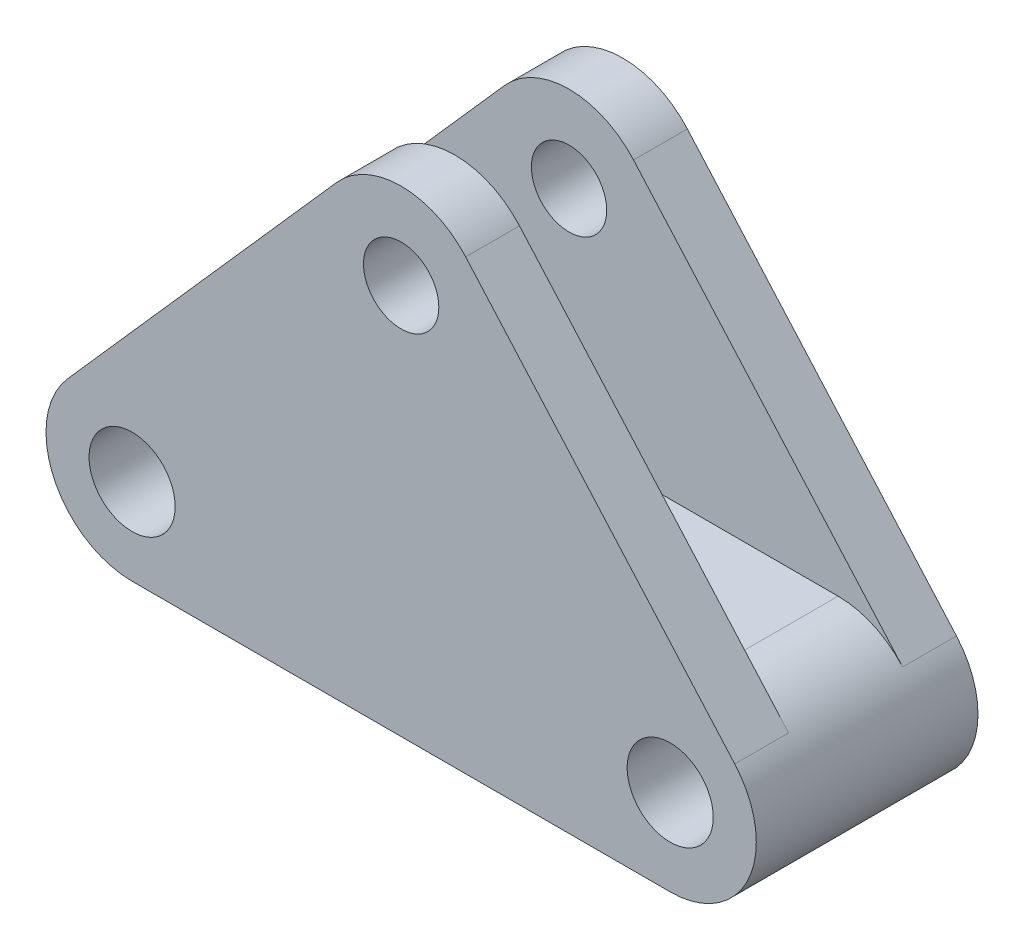
ISO-10303-21;
HEADER;
FILE_DESCRIPTION(('STEP AP214'),'2;1');
FILE_NAME('part.step','',(''),(''),'','','');
FILE_SCHEMA(('AUTOMOTIVE_DESIGN { 1 0 10303 214 1 1 1 1 }'));
ENDSEC;
DATA;
#1=APPLICATION_CONTEXT('core data for automotive mechanical design processes');
#2=APPLICATION_PROTOCOL_DEFINITION('international standard','automotive_design',2000,#1);
#3=PRODUCT_CONTEXT('',#1,'mechanical');
#4=PRODUCT('Part','Part','',(#3));
#5=PRODUCT_RELATED_PRODUCT_CATEGORY('part','',(#4));
#6=PRODUCT_DEFINITION_FORMATION('','',#4);
#7=PRODUCT_DEFINITION_CONTEXT('part definition',#1,'design');
#8=PRODUCT_DEFINITION('design','',#6,#7);
#9=PRODUCT_DEFINITION_SHAPE('','',#8);
#10=(LENGTH_UNIT() NAMED_UNIT(*) SI_UNIT(.MILLI.,.METRE.));
#11=(NAMED_UNIT(*) PLANE_ANGLE_UNIT() SI_UNIT($,.RADIAN.));
#12=(NAMED_UNIT(*) SI_UNIT($,.STERADIAN.) SOLID_ANGLE_UNIT());
#13=UNCERTAINTY_MEASURE_WITH_UNIT(LENGTH_MEASURE(1.E-05),#10,'distance_accuracy_value','');
#14=(GEOMETRIC_REPRESENTATION_CONTEXT(3) GLOBAL_UNCERTAINTY_ASSIGNED_CONTEXT((#13)) GLOBAL_UNIT_ASSIGNED_CONTEXT((#10,
#11,#12)) REPRESENTATION_CONTEXT('',''));
#15=CARTESIAN_POINT('',(0.,0.,0.));
#16=DIRECTION('',(0.,0.,1.));
#17=DIRECTION('',(1.,0.,0.));
#18=AXIS2_PLACEMENT_3D('',#15,#16,#17);
#19=CARTESIAN_POINT('',(0.,0.,-5.));
#20=DIRECTION('',(0.,0.,1.));
#21=DIRECTION('',(1.,0.,0.));
#22=AXIS2_PLACEMENT_3D('',#19,#20,#21);
#23=PLANE('',#22);
#24=CARTESIAN_POINT('',(0.,0.,-5.));
#25=DIRECTION('',(0.,0.,1.));
#26=DIRECTION('',(1.,0.,0.));
#27=AXIS2_PLACEMENT_3D('',#24,#25,#26);
#28=CIRCLE('',#27,3.5);
#29=CARTESIAN_POINT('',(3.5,0.,-5.));
#30=VERTEX_POINT('',#29);
#31=EDGE_CURVE('E219',#30,#30,#28,.T.);
#32=ORIENTED_EDGE('',*,*,#31,.T.);
#33=EDGE_LOOP('',(#32));
#34=FACE_BOUND('',#33,.T.);
#35=CARTESIAN_POINT('',(25.,-28.3,-5.));
#36=DIRECTION('',(0.,0.,1.));
#37=DIRECTION('',(1.,0.,0.));
#38=AXIS2_PLACEMENT_3D('',#35,#36,#37);
#39=CIRCLE('',#38,8.);
#40=CARTESIAN_POINT('',(25.,-20.3,-5.));
#41=VERTEX_POINT('',#40);
#42=CARTESIAN_POINT('',(30.9956104915912,-23.0035243007145,-5.));
#43=VERTEX_POINT('',#42);
#44=EDGE_CURVE('E196',#41,#43,#39,.F.);
#45=ORIENTED_EDGE('',*,*,#44,.F.);
#46=DIRECTION('',(1.,0.,0.));
#47=VECTOR('',#46,1.);
#48=CARTESIAN_POINT('',(0.,-20.3,-5.));
#49=LINE('',#48,#47);
#50=CARTESIAN_POINT('',(-25.,-20.3,-5.));
#51=VERTEX_POINT('',#50);
#52=EDGE_CURVE('E194',#51,#41,#49,.T.);
#53=ORIENTED_EDGE('',*,*,#52,.F.);
#54=CARTESIAN_POINT('',(-25.,-28.3,-5.));
#55=DIRECTION('',(0.,0.,1.));
#56=DIRECTION('',(1.,0.,0.));
#57=AXIS2_PLACEMENT_3D('',#54,#55,#56);
#58=CIRCLE('',#57,8.);
#59=CARTESIAN_POINT('',(-30.9956104915912,-23.0035243007145,-5.));
#60=VERTEX_POINT('',#59);
#61=EDGE_CURVE('E186',#51,#60,#58,.T.);
#62=ORIENTED_EDGE('',*,*,#61,.T.);
#63=DIRECTION('',(0.662059462410687,0.749451311448898,0.));
#64=VECTOR('',#63,1.);
#65=CARTESIAN_POINT('',(-5.99561049159118,5.2964756992855,-5.));
#66=LINE('',#65,#64);
#67=CARTESIAN_POINT('',(-5.99561049159118,5.2964756992855,-5.));
#68=VERTEX_POINT('',#67);
#69=EDGE_CURVE('E217',#60,#68,#66,.T.);
#70=ORIENTED_EDGE('',*,*,#69,.T.);
#71=CARTESIAN_POINT('',(0.,0.,-5.));
#72=DIRECTION('',(0.,0.,1.));
#73=DIRECTION('',(1.,0.,0.));
#74=AXIS2_PLACEMENT_3D('',#71,#72,#73);
#75=CIRCLE('',#74,8.00000000000001);
#76=CARTESIAN_POINT('',(5.99561049159119,5.2964756992855,-5.));
#77=VERTEX_POINT('',#76);
#78=EDGE_CURVE('E220',#68,#77,#75,.F.);
#79=ORIENTED_EDGE('',*,*,#78,.T.);
#80=DIRECTION('',(-0.662059462410687,0.749451311448897,0.));
#81=VECTOR('',#80,1.);
#82=CARTESIAN_POINT('',(5.99561049159119,5.2964756992855,-5.));
#83=LINE('',#82,#81);
#84=EDGE_CURVE('E226',#43,#77,#83,.T.);
#85=ORIENTED_EDGE('',*,*,#84,.F.);
#86=EDGE_LOOP('',(#45,#53,#62,#70,#79,#85));
#87=FACE_BOUND('',#86,.T.);
#88=ADVANCED_FACE('F35',(#34,#87),#23,.F.);
#89=CARTESIAN_POINT('',(25.,-28.3,-5.));
#90=DIRECTION('',(0.,0.,1.));
#91=DIRECTION('',(1.,0.,0.));
#92=AXIS2_PLACEMENT_3D('',#89,#90,#91);
#93=CYLINDRICAL_SURFACE('',#92,8.);
#94=CARTESIAN_POINT('',(25.,-28.3,0.));
#95=DIRECTION('',(0.,0.,1.));
#96=DIRECTION('',(1.,0.,0.));
#97=AXIS2_PLACEMENT_3D('',#94,#95,#96);
#98=CIRCLE('',#97,8.);
#99=CARTESIAN_POINT('',(30.9956104915912,-23.0035243007145,0.));
#100=VERTEX_POINT('',#99);
#101=CARTESIAN_POINT('',(25.,-36.3,0.));
#102=VERTEX_POINT('',#101);
#103=EDGE_CURVE('E199',#100,#102,#98,.F.);
#104=ORIENTED_EDGE('',*,*,#103,.T.);
#105=DIRECTION('',(0.,0.,1.));
#106=VECTOR('',#105,1.);
#107=CARTESIAN_POINT('',(25.,-36.3,-5.));
#108=LINE('',#107,#106);
#109=CARTESIAN_POINT('',(25.,-36.3,-20.6));
#110=VERTEX_POINT('',#109);
#111=EDGE_CURVE('E11',#110,#102,#108,.T.);
#112=ORIENTED_EDGE('',*,*,#111,.F.);
#113=CARTESIAN_POINT('',(25.,-28.3,-20.6));
#114=DIRECTION('',(0.,0.,1.));
#115=DIRECTION('',(1.,0.,0.));
#116=AXIS2_PLACEMENT_3D('',#113,#114,#115);
#117=CIRCLE('',#116,8.);
#118=CARTESIAN_POINT('',(30.9956104915912,-23.0035243007145,-20.6));
#119=VERTEX_POINT('',#118);
#120=EDGE_CURVE('E138',#119,#110,#117,.F.);
#121=ORIENTED_EDGE('',*,*,#120,.F.);
#122=DIRECTION('',(0.,0.,1.));
#123=VECTOR('',#122,1.);
#124=CARTESIAN_POINT('',(30.9956104915912,-23.0035243007145,-20.6));
#125=LINE('',#124,#123);
#126=CARTESIAN_POINT('',(30.9956104915912,-23.0035243007145,-15.6));
#127=VERTEX_POINT('',#126);
#128=EDGE_CURVE('E127',#119,#127,#125,.T.);
#129=ORIENTED_EDGE('',*,*,#128,.T.);
#130=CARTESIAN_POINT('',(25.,-28.3,-15.6));
#131=DIRECTION('',(0.,0.,1.));
#132=DIRECTION('',(1.,0.,0.));
#133=AXIS2_PLACEMENT_3D('',#130,#131,#132);
#134=CIRCLE('',#133,8.);
#135=CARTESIAN_POINT('',(25.,-20.3,-15.6));
#136=VERTEX_POINT('',#135);
#137=EDGE_CURVE('E60',#136,#127,#134,.F.);
#138=ORIENTED_EDGE('',*,*,#137,.F.);
#139=DIRECTION('',(0.,0.,1.));
#140=VECTOR('',#139,1.);
#141=CARTESIAN_POINT('',(25.,-20.3,-15.6));
#142=LINE('',#141,#140);
#143=EDGE_CURVE('E190',#136,#41,#142,.T.);
#144=ORIENTED_EDGE('',*,*,#143,.T.);
#145=ORIENTED_EDGE('',*,*,#44,.T.);
#146=DIRECTION('',(0.,0.,1.));
#147=VECTOR('',#146,1.);
#148=CARTESIAN_POINT('',(30.9956104915912,-23.0035243007145,-5.));
#149=LINE('',#148,#147);
#150=EDGE_CURVE('E223',#43,#100,#149,.T.);
#151=ORIENTED_EDGE('',*,*,#150,.T.);
#152=EDGE_LOOP('',(#104,#112,#121,#129,#138,#144,#145,#151));
#153=FACE_BOUND('',#152,.T.);
#154=ADVANCED_FACE('F37',(#153),#93,.T.);
#155=CARTESIAN_POINT('',(0.,-36.3,-5.));
#156=DIRECTION('',(0.,1.,0.));
#157=DIRECTION('',(-1.,0.,0.));
#158=AXIS2_PLACEMENT_3D('',#155,#156,#157);
#159=PLANE('',#158);
#160=DIRECTION('',(-1.,0.,0.));
#161=VECTOR('',#160,1.);
#162=CARTESIAN_POINT('',(0.,-36.3,0.));
#163=LINE('',#162,#161);
#164=CARTESIAN_POINT('',(-25.,-36.3,0.));
#165=VERTEX_POINT('',#164);
#166=EDGE_CURVE('E270',#102,#165,#163,.T.);
#167=ORIENTED_EDGE('',*,*,#166,.T.);
#168=DIRECTION('',(0.,0.,1.));
#169=VECTOR('',#168,1.);
#170=CARTESIAN_POINT('',(-25.,-36.3,-5.));
#171=LINE('',#170,#169);
#172=CARTESIAN_POINT('',(-25.,-36.3,-20.6));
#173=VERTEX_POINT('',#172);
#174=EDGE_CURVE('E44',#173,#165,#171,.T.);
#175=ORIENTED_EDGE('',*,*,#174,.F.);
#176=DIRECTION('',(-1.,0.,0.));
#177=VECTOR('',#176,1.);
#178=CARTESIAN_POINT('',(0.,-36.3,-20.6));
#179=LINE('',#178,#177);
#180=EDGE_CURVE('E158',#110,#173,#179,.T.);
#181=ORIENTED_EDGE('',*,*,#180,.F.);
#182=ORIENTED_EDGE('',*,*,#111,.T.);
#183=EDGE_LOOP('',(#167,#175,#181,#182));
#184=FACE_BOUND('',#183,.T.);
#185=ADVANCED_FACE('F307',(#184),#159,.F.);
#186=CARTESIAN_POINT('',(-25.,-28.3,-5.));
#187=DIRECTION('',(0.,0.,1.));
#188=DIRECTION('',(1.,0.,0.));
#189=AXIS2_PLACEMENT_3D('',#186,#187,#188);
#190=CYLINDRICAL_SURFACE('',#189,8.);
#191=CARTESIAN_POINT('',(-25.,-28.3,0.));
#192=DIRECTION('',(0.,0.,1.));
#193=DIRECTION('',(1.,0.,0.));
#194=AXIS2_PLACEMENT_3D('',#191,#192,#193);
#195=CIRCLE('',#194,8.);
#196=CARTESIAN_POINT('',(-30.9956104915912,-23.0035243007145,0.));
#197=VERTEX_POINT('',#196);
#198=EDGE_CURVE('E267',#197,#165,#195,.T.);
#199=ORIENTED_EDGE('',*,*,#198,.F.);
#200=DIRECTION('',(0.,0.,1.));
#201=VECTOR('',#200,1.);
#202=CARTESIAN_POINT('',(-30.9956104915912,-23.0035243007145,-5.));
#203=LINE('',#202,#201);
#204=EDGE_CURVE('E212',#60,#197,#203,.T.);
#205=ORIENTED_EDGE('',*,*,#204,.F.);
#206=ORIENTED_EDGE('',*,*,#61,.F.);
#207=DIRECTION('',(0.,0.,1.));
#208=VECTOR('',#207,1.);
#209=CARTESIAN_POINT('',(-25.,-20.3,-15.6));
#210=LINE('',#209,#208);
#211=CARTESIAN_POINT('',(-25.,-20.3,-15.6));
#212=VERTEX_POINT('',#211);
#213=EDGE_CURVE('E197',#212,#51,#210,.T.);
#214=ORIENTED_EDGE('',*,*,#213,.F.);
#215=CARTESIAN_POINT('',(-25.,-28.3,-15.6));
#216=DIRECTION('',(0.,0.,1.));
#217=DIRECTION('',(1.,0.,0.));
#218=AXIS2_PLACEMENT_3D('',#215,#216,#217);
#219=CIRCLE('',#218,8.);
#220=CARTESIAN_POINT('',(-30.9956104915912,-23.0035243007145,-15.6));
#221=VERTEX_POINT('',#220);
#222=EDGE_CURVE('E52',#212,#221,#219,.T.);
#223=ORIENTED_EDGE('',*,*,#222,.T.);
#224=DIRECTION('',(0.,0.,1.));
#225=VECTOR('',#224,1.);
#226=CARTESIAN_POINT('',(-30.9956104915912,-23.0035243007145,-20.6));
#227=LINE('',#226,#225);
#228=CARTESIAN_POINT('',(-30.9956104915912,-23.0035243007145,-20.6));
#229=VERTEX_POINT('',#228);
#230=EDGE_CURVE('E177',#229,#221,#227,.T.);
#231=ORIENTED_EDGE('',*,*,#230,.F.);
#232=CARTESIAN_POINT('',(-25.,-28.3,-20.6));
#233=DIRECTION('',(0.,0.,1.));
#234=DIRECTION('',(1.,0.,0.));
#235=AXIS2_PLACEMENT_3D('',#232,#233,#234);
#236=CIRCLE('',#235,8.);
#237=EDGE_CURVE('E155',#229,#173,#236,.T.);
#238=ORIENTED_EDGE('',*,*,#237,.T.);
#239=ORIENTED_EDGE('',*,*,#174,.T.);
#240=EDGE_LOOP('',(#199,#205,#206,#214,#223,#231,#238,#239));
#241=FACE_BOUND('',#240,.T.);
#242=ADVANCED_FACE('F319',(#241),#190,.T.);
#243=CARTESIAN_POINT('',(-5.99561049159118,5.2964756992855,-5.));
#244=DIRECTION('',(0.749451311448898,-0.662059462410687,0.));
#245=DIRECTION('',(0.662059462410687,0.749451311448898,0.));
#246=AXIS2_PLACEMENT_3D('',#243,#244,#245);
#247=PLANE('',#246);
#248=DIRECTION('',(0.662059462410687,0.749451311448898,0.));
#249=VECTOR('',#248,1.);
#250=CARTESIAN_POINT('',(-5.99561049159118,5.2964756992855,0.));
#251=LINE('',#250,#249);
#252=CARTESIAN_POINT('',(-5.99561049159118,5.2964756992855,0.));
#253=VERTEX_POINT('',#252);
#254=EDGE_CURVE('E257',#197,#253,#251,.T.);
#255=ORIENTED_EDGE('',*,*,#254,.T.);
#256=DIRECTION('',(0.,0.,1.));
#257=VECTOR('',#256,1.);
#258=CARTESIAN_POINT('',(-5.99561049159118,5.2964756992855,-5.));
#259=LINE('',#258,#257);
#260=EDGE_CURVE('E214',#68,#253,#259,.T.);
#261=ORIENTED_EDGE('',*,*,#260,.F.);
#262=ORIENTED_EDGE('',*,*,#69,.F.);
#263=ORIENTED_EDGE('',*,*,#204,.T.);
#264=EDGE_LOOP('',(#255,#261,#262,#263));
#265=FACE_BOUND('',#264,.T.);
#266=ADVANCED_FACE('F323',(#265),#247,.F.);
#267=CARTESIAN_POINT('',(0.,0.,-5.));
#268=DIRECTION('',(0.,0.,1.));
#269=DIRECTION('',(1.,0.,0.));
#270=AXIS2_PLACEMENT_3D('',#267,#268,#269);
#271=CYLINDRICAL_SURFACE('',#270,8.00000000000001);
#272=CARTESIAN_POINT('',(0.,0.,0.));
#273=DIRECTION('',(0.,0.,1.));
#274=DIRECTION('',(1.,0.,0.));
#275=AXIS2_PLACEMENT_3D('',#272,#273,#274);
#276=CIRCLE('',#275,8.00000000000001);
#277=CARTESIAN_POINT('',(5.99561049159119,5.2964756992855,0.));
#278=VERTEX_POINT('',#277);
#279=EDGE_CURVE('E253',#253,#278,#276,.F.);
#280=ORIENTED_EDGE('',*,*,#279,.T.);
#281=DIRECTION('',(0.,0.,1.));
#282=VECTOR('',#281,1.);
#283=CARTESIAN_POINT('',(5.99561049159119,5.2964756992855,-5.));
#284=LINE('',#283,#282);
#285=EDGE_CURVE('E208',#77,#278,#284,.T.);
#286=ORIENTED_EDGE('',*,*,#285,.F.);
#287=ORIENTED_EDGE('',*,*,#78,.F.);
#288=ORIENTED_EDGE('',*,*,#260,.T.);
#289=EDGE_LOOP('',(#280,#286,#287,#288));
#290=FACE_BOUND('',#289,.T.);
#291=ADVANCED_FACE('F254',(#290),#271,.T.);
#292=CARTESIAN_POINT('',(25.,-28.3,-5.));
#293=DIRECTION('',(0.,0.,1.));
#294=DIRECTION('',(1.,0.,0.));
#295=AXIS2_PLACEMENT_3D('',#292,#293,#294);
#296=CYLINDRICAL_SURFACE('',#295,4.);
#297=CARTESIAN_POINT('',(25.,-28.3,0.));
#298=DIRECTION('',(0.,0.,1.));
#299=DIRECTION('',(1.,0.,0.));
#300=AXIS2_PLACEMENT_3D('',#297,#298,#299);
#301=CIRCLE('',#300,4.);
#302=CARTESIAN_POINT('',(29.,-28.3,0.));
#303=VERTEX_POINT('',#302);
#304=EDGE_CURVE('E233',#303,#303,#301,.F.);
#305=ORIENTED_EDGE('',*,*,#304,.F.);
#306=EDGE_LOOP('',(#305));
#307=FACE_BOUND('',#306,.T.);
#308=CARTESIAN_POINT('',(25.,-28.3,-20.6));
#309=DIRECTION('',(0.,0.,1.));
#310=DIRECTION('',(1.,0.,0.));
#311=AXIS2_PLACEMENT_3D('',#308,#309,#310);
#312=CIRCLE('',#311,4.);
#313=CARTESIAN_POINT('',(29.,-28.3,-20.6));
#314=VERTEX_POINT('',#313);
#315=EDGE_CURVE('E135',#314,#314,#312,.F.);
#316=ORIENTED_EDGE('',*,*,#315,.T.);
#317=EDGE_LOOP('',(#316));
#318=FACE_BOUND('',#317,.T.);
#319=ADVANCED_FACE('F285',(#307,#318),#296,.F.);
#320=CARTESIAN_POINT('',(-25.,-28.3,-5.));
#321=DIRECTION('',(0.,0.,1.));
#322=DIRECTION('',(1.,0.,0.));
#323=AXIS2_PLACEMENT_3D('',#320,#321,#322);
#324=CYLINDRICAL_SURFACE('',#323,4.);
#325=CARTESIAN_POINT('',(-25.,-28.3,0.));
#326=DIRECTION('',(0.,0.,1.));
#327=DIRECTION('',(1.,0.,0.));
#328=AXIS2_PLACEMENT_3D('',#325,#326,#327);
#329=CIRCLE('',#328,4.);
#330=CARTESIAN_POINT('',(-21.,-28.3,0.));
#331=VERTEX_POINT('',#330);
#332=EDGE_CURVE('E238',#331,#331,#329,.T.);
#333=ORIENTED_EDGE('',*,*,#332,.T.);
#334=EDGE_LOOP('',(#333));
#335=FACE_BOUND('',#334,.T.);
#336=CARTESIAN_POINT('',(-25.,-28.3,-20.6));
#337=DIRECTION('',(0.,0.,1.));
#338=DIRECTION('',(1.,0.,0.));
#339=AXIS2_PLACEMENT_3D('',#336,#337,#338);
#340=CIRCLE('',#339,4.);
#341=CARTESIAN_POINT('',(-21.,-28.3,-20.6));
#342=VERTEX_POINT('',#341);
#343=EDGE_CURVE('E163',#342,#342,#340,.T.);
#344=ORIENTED_EDGE('',*,*,#343,.F.);
#345=EDGE_LOOP('',(#344));
#346=FACE_BOUND('',#345,.T.);
#347=ADVANCED_FACE('F275',(#335,#346),#324,.F.);
#348=CARTESIAN_POINT('',(5.99561049159119,5.2964756992855,-5.));
#349=DIRECTION('',(0.749451311448897,0.662059462410687,0.));
#350=DIRECTION('',(-0.662059462410687,0.749451311448897,0.));
#351=AXIS2_PLACEMENT_3D('',#348,#349,#350);
#352=PLANE('',#351);
#353=DIRECTION('',(-0.662059462410687,0.749451311448897,0.));
#354=VECTOR('',#353,1.);
#355=CARTESIAN_POINT('',(5.99561049159119,5.2964756992855,0.));
#356=LINE('',#355,#354);
#357=EDGE_CURVE('E252',#100,#278,#356,.T.);
#358=ORIENTED_EDGE('',*,*,#357,.F.);
#359=ORIENTED_EDGE('',*,*,#150,.F.);
#360=ORIENTED_EDGE('',*,*,#84,.T.);
#361=ORIENTED_EDGE('',*,*,#285,.T.);
#362=EDGE_LOOP('',(#358,#359,#360,#361));
#363=FACE_BOUND('',#362,.T.);
#364=ADVANCED_FACE('F250',(#363),#352,.T.);
#365=CARTESIAN_POINT('',(0.,0.,-5.));
#366=DIRECTION('',(0.,0.,1.));
#367=DIRECTION('',(1.,0.,0.));
#368=AXIS2_PLACEMENT_3D('',#365,#366,#367);
#369=CYLINDRICAL_SURFACE('',#368,3.5);
#370=ORIENTED_EDGE('',*,*,#31,.F.);
#371=EDGE_LOOP('',(#370));
#372=FACE_BOUND('',#371,.T.);
#373=CARTESIAN_POINT('',(0.,0.,0.));
#374=DIRECTION('',(0.,0.,1.));
#375=DIRECTION('',(1.,0.,0.));
#376=AXIS2_PLACEMENT_3D('',#373,#374,#375);
#377=CIRCLE('',#376,3.5);
#378=CARTESIAN_POINT('',(3.5,0.,0.));
#379=VERTEX_POINT('',#378);
#380=EDGE_CURVE('E228',#379,#379,#377,.T.);
#381=ORIENTED_EDGE('',*,*,#380,.T.);
#382=EDGE_LOOP('',(#381));
#383=FACE_BOUND('',#382,.T.);
#384=ADVANCED_FACE('F280',(#372,#383),#369,.F.);
#385=CARTESIAN_POINT('',(0.,0.,0.));
#386=DIRECTION('',(0.,0.,1.));
#387=DIRECTION('',(1.,0.,0.));
#388=AXIS2_PLACEMENT_3D('',#385,#386,#387);
#389=PLANE('',#388);
#390=ORIENTED_EDGE('',*,*,#103,.F.);
#391=ORIENTED_EDGE('',*,*,#357,.T.);
#392=ORIENTED_EDGE('',*,*,#279,.F.);
#393=ORIENTED_EDGE('',*,*,#254,.F.);
#394=ORIENTED_EDGE('',*,*,#198,.T.);
#395=ORIENTED_EDGE('',*,*,#166,.F.);
#396=EDGE_LOOP('',(#390,#391,#392,#393,#394,#395));
#397=FACE_BOUND('',#396,.T.);
#398=ORIENTED_EDGE('',*,*,#332,.F.);
#399=EDGE_LOOP('',(#398));
#400=FACE_BOUND('',#399,.T.);
#401=ORIENTED_EDGE('',*,*,#304,.T.);
#402=EDGE_LOOP('',(#401));
#403=FACE_BOUND('',#402,.T.);
#404=ORIENTED_EDGE('',*,*,#380,.F.);
#405=EDGE_LOOP('',(#404));
#406=FACE_BOUND('',#405,.T.);
#407=ADVANCED_FACE('F260',(#397,#400,#403,#406),#389,.T.);
#408=CARTESIAN_POINT('',(0.,-20.3,-15.6));
#409=DIRECTION('',(0.,-1.,0.));
#410=DIRECTION('',(1.,0.,0.));
#411=AXIS2_PLACEMENT_3D('',#408,#409,#410);
#412=PLANE('',#411);
#413=ORIENTED_EDGE('',*,*,#52,.T.);
#414=ORIENTED_EDGE('',*,*,#143,.F.);
#415=DIRECTION('',(1.,0.,0.));
#416=VECTOR('',#415,1.);
#417=CARTESIAN_POINT('',(0.,-20.3,-15.6));
#418=LINE('',#417,#416);
#419=EDGE_CURVE('E181',#212,#136,#418,.T.);
#420=ORIENTED_EDGE('',*,*,#419,.F.);
#421=ORIENTED_EDGE('',*,*,#213,.T.);
#422=EDGE_LOOP('',(#413,#414,#420,#421));
#423=FACE_BOUND('',#422,.T.);
#424=ADVANCED_FACE('F279',(#423),#412,.F.);
#425=CARTESIAN_POINT('',(-5.99561049159118,5.2964756992855,-20.6));
#426=DIRECTION('',(0.749451311448898,-0.662059462410687,0.));
#427=DIRECTION('',(0.662059462410687,0.749451311448898,0.));
#428=AXIS2_PLACEMENT_3D('',#425,#426,#427);
#429=PLANE('',#428);
#430=DIRECTION('',(0.662059462410687,0.749451311448898,0.));
#431=VECTOR('',#430,1.);
#432=CARTESIAN_POINT('',(-5.99561049159118,5.2964756992855,-15.6));
#433=LINE('',#432,#431);
#434=CARTESIAN_POINT('',(-5.99561049159118,5.2964756992855,-15.6));
#435=VERTEX_POINT('',#434);
#436=EDGE_CURVE('E171',#221,#435,#433,.T.);
#437=ORIENTED_EDGE('',*,*,#436,.T.);
#438=DIRECTION('',(0.,0.,1.));
#439=VECTOR('',#438,1.);
#440=CARTESIAN_POINT('',(-5.99561049159118,5.2964756992855,-20.6));
#441=LINE('',#440,#439);
#442=CARTESIAN_POINT('',(-5.99561049159118,5.2964756992855,-20.6));
#443=VERTEX_POINT('',#442);
#444=EDGE_CURVE('E174',#443,#435,#441,.T.);
#445=ORIENTED_EDGE('',*,*,#444,.F.);
#446=DIRECTION('',(0.662059462410687,0.749451311448898,0.));
#447=VECTOR('',#446,1.);
#448=CARTESIAN_POINT('',(-5.99561049159118,5.2964756992855,-20.6));
#449=LINE('',#448,#447);
#450=EDGE_CURVE('E151',#229,#443,#449,.T.);
#451=ORIENTED_EDGE('',*,*,#450,.F.);
#452=ORIENTED_EDGE('',*,*,#230,.T.);
#453=EDGE_LOOP('',(#437,#445,#451,#452));
#454=FACE_BOUND('',#453,.T.);
#455=ADVANCED_FACE('F350',(#454),#429,.F.);
#456=CARTESIAN_POINT('',(0.,0.,-20.6));
#457=DIRECTION('',(0.,0.,1.));
#458=DIRECTION('',(1.,0.,0.));
#459=AXIS2_PLACEMENT_3D('',#456,#457,#458);
#460=CYLINDRICAL_SURFACE('',#459,8.00000000000001);
#461=CARTESIAN_POINT('',(0.,0.,-15.6));
#462=DIRECTION('',(0.,0.,1.));
#463=DIRECTION('',(1.,0.,0.));
#464=AXIS2_PLACEMENT_3D('',#461,#462,#463);
#465=CIRCLE('',#464,8.00000000000001);
#466=CARTESIAN_POINT('',(5.99561049159119,5.2964756992855,-15.6));
#467=VERTEX_POINT('',#466);
#468=EDGE_CURVE('E168',#435,#467,#465,.F.);
#469=ORIENTED_EDGE('',*,*,#468,.T.);
#470=DIRECTION('',(0.,0.,1.));
#471=VECTOR('',#470,1.);
#472=CARTESIAN_POINT('',(5.99561049159119,5.2964756992855,-20.6));
#473=LINE('',#472,#471);
#474=CARTESIAN_POINT('',(5.99561049159119,5.2964756992855,-20.6));
#475=VERTEX_POINT('',#474);
#476=EDGE_CURVE('E134',#475,#467,#473,.T.);
#477=ORIENTED_EDGE('',*,*,#476,.F.);
#478=CARTESIAN_POINT('',(0.,0.,-20.6));
#479=DIRECTION('',(0.,0.,1.));
#480=DIRECTION('',(1.,0.,0.));
#481=AXIS2_PLACEMENT_3D('',#478,#479,#480);
#482=CIRCLE('',#481,8.00000000000001);
#483=EDGE_CURVE('E148',#443,#475,#482,.F.);
#484=ORIENTED_EDGE('',*,*,#483,.F.);
#485=ORIENTED_EDGE('',*,*,#444,.T.);
#486=EDGE_LOOP('',(#469,#477,#484,#485));
#487=FACE_BOUND('',#486,.T.);
#488=ADVANCED_FACE('F357',(#487),#460,.T.);
#489=CARTESIAN_POINT('',(0.,0.,-20.6));
#490=DIRECTION('',(0.,0.,1.));
#491=DIRECTION('',(1.,0.,0.));
#492=AXIS2_PLACEMENT_3D('',#489,#490,#491);
#493=CYLINDRICAL_SURFACE('',#492,3.5);
#494=CARTESIAN_POINT('',(0.,0.,-20.6));
#495=DIRECTION('',(0.,0.,1.));
#496=DIRECTION('',(1.,0.,0.));
#497=AXIS2_PLACEMENT_3D('',#494,#495,#496);
#498=CIRCLE('',#497,3.5);
#499=CARTESIAN_POINT('',(3.5,0.,-20.6));
#500=VERTEX_POINT('',#499);
#501=EDGE_CURVE('E160',#500,#500,#498,.T.);
#502=ORIENTED_EDGE('',*,*,#501,.F.);
#503=EDGE_LOOP('',(#502));
#504=FACE_BOUND('',#503,.T.);
#505=CARTESIAN_POINT('',(0.,0.,-15.6));
#506=DIRECTION('',(0.,0.,1.));
#507=DIRECTION('',(1.,0.,0.));
#508=AXIS2_PLACEMENT_3D('',#505,#506,#507);
#509=CIRCLE('',#508,3.5);
#510=CARTESIAN_POINT('',(3.5,0.,-15.6));
#511=VERTEX_POINT('',#510);
#512=EDGE_CURVE('E143',#511,#511,#509,.T.);
#513=ORIENTED_EDGE('',*,*,#512,.T.);
#514=EDGE_LOOP('',(#513));
#515=FACE_BOUND('',#514,.T.);
#516=ADVANCED_FACE('F299',(#504,#515),#493,.F.);
#517=CARTESIAN_POINT('',(5.99561049159119,5.2964756992855,-20.6));
#518=DIRECTION('',(0.749451311448897,0.662059462410687,0.));
#519=DIRECTION('',(-0.662059462410687,0.749451311448897,0.));
#520=AXIS2_PLACEMENT_3D('',#517,#518,#519);
#521=PLANE('',#520);
#522=DIRECTION('',(-0.662059462410687,0.749451311448897,0.));
#523=VECTOR('',#522,1.);
#524=CARTESIAN_POINT('',(5.99561049159119,5.2964756992855,-15.6));
#525=LINE('',#524,#523);
#526=EDGE_CURVE('E132',#127,#467,#525,.T.);
#527=ORIENTED_EDGE('',*,*,#526,.F.);
#528=ORIENTED_EDGE('',*,*,#128,.F.);
#529=DIRECTION('',(-0.662059462410687,0.749451311448897,0.));
#530=VECTOR('',#529,1.);
#531=CARTESIAN_POINT('',(5.99561049159119,5.2964756992855,-20.6));
#532=LINE('',#531,#530);
#533=EDGE_CURVE('E131',#119,#475,#532,.T.);
#534=ORIENTED_EDGE('',*,*,#533,.T.);
#535=ORIENTED_EDGE('',*,*,#476,.T.);
#536=EDGE_LOOP('',(#527,#528,#534,#535));
#537=FACE_BOUND('',#536,.T.);
#538=ADVANCED_FACE('F129',(#537),#521,.T.);
#539=CARTESIAN_POINT('',(0.,0.,-20.6));
#540=DIRECTION('',(0.,0.,1.));
#541=DIRECTION('',(1.,0.,0.));
#542=AXIS2_PLACEMENT_3D('',#539,#540,#541);
#543=PLANE('',#542);
#544=ORIENTED_EDGE('',*,*,#120,.T.);
#545=ORIENTED_EDGE('',*,*,#180,.T.);
#546=ORIENTED_EDGE('',*,*,#237,.F.);
#547=ORIENTED_EDGE('',*,*,#450,.T.);
#548=ORIENTED_EDGE('',*,*,#483,.T.);
#549=ORIENTED_EDGE('',*,*,#533,.F.);
#550=EDGE_LOOP('',(#544,#545,#546,#547,#548,#549));
#551=FACE_BOUND('',#550,.T.);
#552=ORIENTED_EDGE('',*,*,#501,.T.);
#553=EDGE_LOOP('',(#552));
#554=FACE_BOUND('',#553,.T.);
#555=ORIENTED_EDGE('',*,*,#343,.T.);
#556=EDGE_LOOP('',(#555));
#557=FACE_BOUND('',#556,.T.);
#558=ORIENTED_EDGE('',*,*,#315,.F.);
#559=EDGE_LOOP('',(#558));
#560=FACE_BOUND('',#559,.T.);
#561=ADVANCED_FACE('F145',(#551,#554,#557,#560),#543,.F.);
#562=CARTESIAN_POINT('',(0.,0.,-15.6));
#563=DIRECTION('',(0.,0.,1.));
#564=DIRECTION('',(1.,0.,0.));
#565=AXIS2_PLACEMENT_3D('',#562,#563,#564);
#566=PLANE('',#565);
#567=ORIENTED_EDGE('',*,*,#419,.T.);
#568=ORIENTED_EDGE('',*,*,#137,.T.);
#569=ORIENTED_EDGE('',*,*,#526,.T.);
#570=ORIENTED_EDGE('',*,*,#468,.F.);
#571=ORIENTED_EDGE('',*,*,#436,.F.);
#572=ORIENTED_EDGE('',*,*,#222,.F.);
#573=EDGE_LOOP('',(#567,#568,#569,#570,#571,#572));
#574=FACE_BOUND('',#573,.T.);
#575=ORIENTED_EDGE('',*,*,#512,.F.);
#576=EDGE_LOOP('',(#575));
#577=FACE_BOUND('',#576,.T.);
#578=ADVANCED_FACE('F292',(#574,#577),#566,.T.);
#579=CLOSED_SHELL('',(#88,#154,#185,#242,#266,#291,#319,#347,#364,#384,#407,#424,#455,#488,#516,
#538,#561,#578));
#580=MANIFOLD_SOLID_BREP('B2',#579);
#581=ADVANCED_BREP_SHAPE_REPRESENTATION('',(#18,#580),#14);
#582=SHAPE_DEFINITION_REPRESENTATION(#9,#581);
ENDSEC;
END-ISO-10303-21;
